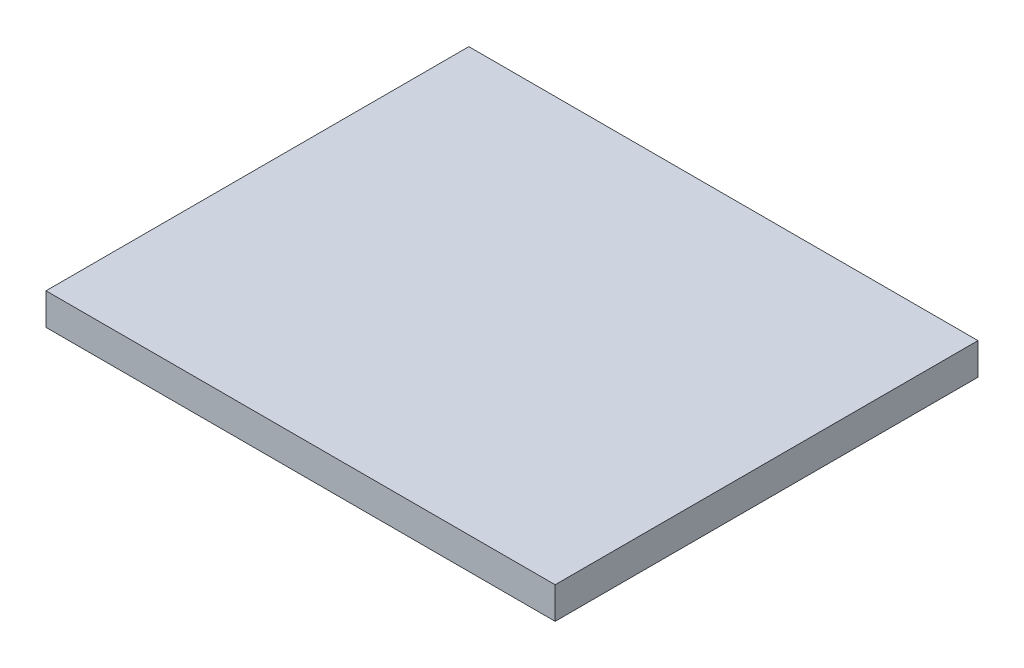
ISO-10303-21;
HEADER;
FILE_DESCRIPTION(('STEP AP214'),'2;1');
FILE_NAME('part.step','',(''),(''),'','','');
FILE_SCHEMA(('AUTOMOTIVE_DESIGN { 1 0 10303 214 1 1 1 1 }'));
ENDSEC;
DATA;
#1=APPLICATION_CONTEXT('core data for automotive mechanical design processes');
#2=APPLICATION_PROTOCOL_DEFINITION('international standard','automotive_design',2000,#1);
#3=PRODUCT_CONTEXT('',#1,'mechanical');
#4=PRODUCT('Part','Part','',(#3));
#5=PRODUCT_RELATED_PRODUCT_CATEGORY('part','',(#4));
#6=PRODUCT_DEFINITION_FORMATION('','',#4);
#7=PRODUCT_DEFINITION_CONTEXT('part definition',#1,'design');
#8=PRODUCT_DEFINITION('design','',#6,#7);
#9=PRODUCT_DEFINITION_SHAPE('','',#8);
#10=(LENGTH_UNIT() NAMED_UNIT(*) SI_UNIT(.MILLI.,.METRE.));
#11=(NAMED_UNIT(*) PLANE_ANGLE_UNIT() SI_UNIT($,.RADIAN.));
#12=(NAMED_UNIT(*) SI_UNIT($,.STERADIAN.) SOLID_ANGLE_UNIT());
#13=UNCERTAINTY_MEASURE_WITH_UNIT(LENGTH_MEASURE(1.E-05),#10,'distance_accuracy_value','');
#14=(GEOMETRIC_REPRESENTATION_CONTEXT(3) GLOBAL_UNCERTAINTY_ASSIGNED_CONTEXT((#13)) GLOBAL_UNIT_ASSIGNED_CONTEXT((#10,
#11,#12)) REPRESENTATION_CONTEXT('',''));
#15=CARTESIAN_POINT('',(0.,0.,0.));
#16=DIRECTION('',(0.,0.,1.));
#17=DIRECTION('',(1.,0.,0.));
#18=AXIS2_PLACEMENT_3D('',#15,#16,#17);
#19=CARTESIAN_POINT('',(0.,1.,0.));
#20=DIRECTION('',(1.,0.,0.));
#21=DIRECTION('',(0.,0.,-1.));
#22=AXIS2_PLACEMENT_3D('',#19,#20,#21);
#23=PLANE('',#22);
#24=DIRECTION('',(0.,0.,1.));
#25=VECTOR('',#24,1.);
#26=CARTESIAN_POINT('',(0.,0.,0.));
#27=LINE('',#26,#25);
#28=CARTESIAN_POINT('',(0.,0.,-13.33));
#29=VERTEX_POINT('',#28);
#30=CARTESIAN_POINT('',(0.,0.,0.));
#31=VERTEX_POINT('',#30);
#32=EDGE_CURVE('E101',#29,#31,#27,.T.);
#33=ORIENTED_EDGE('',*,*,#32,.T.);
#34=DIRECTION('',(0.,-1.,0.));
#35=VECTOR('',#34,1.);
#36=CARTESIAN_POINT('',(0.,1.,0.));
#37=LINE('',#36,#35);
#38=CARTESIAN_POINT('',(0.,1.,0.));
#39=VERTEX_POINT('',#38);
#40=EDGE_CURVE('E11',#39,#31,#37,.T.);
#41=ORIENTED_EDGE('',*,*,#40,.F.);
#42=DIRECTION('',(0.,0.,1.));
#43=VECTOR('',#42,1.);
#44=CARTESIAN_POINT('',(0.,1.,0.));
#45=LINE('',#44,#43);
#46=CARTESIAN_POINT('',(0.,1.,-13.33));
#47=VERTEX_POINT('',#46);
#48=EDGE_CURVE('E89',#47,#39,#45,.T.);
#49=ORIENTED_EDGE('',*,*,#48,.F.);
#50=DIRECTION('',(0.,-1.,0.));
#51=VECTOR('',#50,1.);
#52=CARTESIAN_POINT('',(0.,1.,-13.33));
#53=LINE('',#52,#51);
#54=EDGE_CURVE('E97',#47,#29,#53,.T.);
#55=ORIENTED_EDGE('',*,*,#54,.T.);
#56=EDGE_LOOP('',(#33,#41,#49,#55));
#57=FACE_BOUND('',#56,.T.);
#58=ADVANCED_FACE('F38',(#57),#23,.F.);
#59=CARTESIAN_POINT('',(0.,1.,0.));
#60=DIRECTION('',(0.,0.,-1.));
#61=DIRECTION('',(-1.,0.,0.));
#62=AXIS2_PLACEMENT_3D('',#59,#60,#61);
#63=PLANE('',#62);
#64=DIRECTION('',(1.,0.,0.));
#65=VECTOR('',#64,1.);
#66=CARTESIAN_POINT('',(0.,0.,0.));
#67=LINE('',#66,#65);
#68=CARTESIAN_POINT('',(16.05,0.,0.));
#69=VERTEX_POINT('',#68);
#70=EDGE_CURVE('E93',#31,#69,#67,.T.);
#71=ORIENTED_EDGE('',*,*,#70,.T.);
#72=DIRECTION('',(0.,-1.,0.));
#73=VECTOR('',#72,1.);
#74=CARTESIAN_POINT('',(16.05,1.,0.));
#75=LINE('',#74,#73);
#76=CARTESIAN_POINT('',(16.05,1.,0.));
#77=VERTEX_POINT('',#76);
#78=EDGE_CURVE('E46',#77,#69,#75,.T.);
#79=ORIENTED_EDGE('',*,*,#78,.F.);
#80=DIRECTION('',(1.,0.,0.));
#81=VECTOR('',#80,1.);
#82=CARTESIAN_POINT('',(0.,1.,0.));
#83=LINE('',#82,#81);
#84=EDGE_CURVE('E84',#39,#77,#83,.T.);
#85=ORIENTED_EDGE('',*,*,#84,.F.);
#86=ORIENTED_EDGE('',*,*,#40,.T.);
#87=EDGE_LOOP('',(#71,#79,#85,#86));
#88=FACE_BOUND('',#87,.T.);
#89=ADVANCED_FACE('F92',(#88),#63,.F.);
#90=CARTESIAN_POINT('',(16.05,1.,0.));
#91=DIRECTION('',(-1.,0.,0.));
#92=DIRECTION('',(0.,0.,1.));
#93=AXIS2_PLACEMENT_3D('',#90,#91,#92);
#94=PLANE('',#93);
#95=DIRECTION('',(0.,0.,-1.));
#96=VECTOR('',#95,1.);
#97=CARTESIAN_POINT('',(16.05,0.,0.));
#98=LINE('',#97,#96);
#99=CARTESIAN_POINT('',(16.05,0.,-13.33));
#100=VERTEX_POINT('',#99);
#101=EDGE_CURVE('E71',#69,#100,#98,.T.);
#102=ORIENTED_EDGE('',*,*,#101,.T.);
#103=DIRECTION('',(0.,-1.,0.));
#104=VECTOR('',#103,1.);
#105=CARTESIAN_POINT('',(16.05,1.,-13.33));
#106=LINE('',#105,#104);
#107=CARTESIAN_POINT('',(16.05,1.,-13.33));
#108=VERTEX_POINT('',#107);
#109=EDGE_CURVE('E94',#108,#100,#106,.T.);
#110=ORIENTED_EDGE('',*,*,#109,.F.);
#111=DIRECTION('',(0.,0.,-1.));
#112=VECTOR('',#111,1.);
#113=CARTESIAN_POINT('',(16.05,1.,0.));
#114=LINE('',#113,#112);
#115=EDGE_CURVE('E87',#77,#108,#114,.T.);
#116=ORIENTED_EDGE('',*,*,#115,.F.);
#117=ORIENTED_EDGE('',*,*,#78,.T.);
#118=EDGE_LOOP('',(#102,#110,#116,#117));
#119=FACE_BOUND('',#118,.T.);
#120=ADVANCED_FACE('F95',(#119),#94,.F.);
#121=CARTESIAN_POINT('',(0.,1.,-13.33));
#122=DIRECTION('',(0.,0.,1.));
#123=DIRECTION('',(1.,0.,0.));
#124=AXIS2_PLACEMENT_3D('',#121,#122,#123);
#125=PLANE('',#124);
#126=DIRECTION('',(-1.,0.,0.));
#127=VECTOR('',#126,1.);
#128=CARTESIAN_POINT('',(0.,0.,-13.33));
#129=LINE('',#128,#127);
#130=EDGE_CURVE('E77',#100,#29,#129,.T.);
#131=ORIENTED_EDGE('',*,*,#130,.T.);
#132=ORIENTED_EDGE('',*,*,#54,.F.);
#133=DIRECTION('',(-1.,0.,0.));
#134=VECTOR('',#133,1.);
#135=CARTESIAN_POINT('',(0.,1.,-13.33));
#136=LINE('',#135,#134);
#137=EDGE_CURVE('E54',#108,#47,#136,.T.);
#138=ORIENTED_EDGE('',*,*,#137,.F.);
#139=ORIENTED_EDGE('',*,*,#109,.T.);
#140=EDGE_LOOP('',(#131,#132,#138,#139));
#141=FACE_BOUND('',#140,.T.);
#142=ADVANCED_FACE('F108',(#141),#125,.F.);
#143=CARTESIAN_POINT('',(0.,1.,0.));
#144=DIRECTION('',(0.,-1.,0.));
#145=DIRECTION('',(0.,0.,-1.));
#146=AXIS2_PLACEMENT_3D('',#143,#144,#145);
#147=PLANE('',#146);
#148=ORIENTED_EDGE('',*,*,#48,.T.);
#149=ORIENTED_EDGE('',*,*,#84,.T.);
#150=ORIENTED_EDGE('',*,*,#115,.T.);
#151=ORIENTED_EDGE('',*,*,#137,.T.);
#152=EDGE_LOOP('',(#148,#149,#150,#151));
#153=FACE_BOUND('',#152,.T.);
#154=ADVANCED_FACE('F85',(#153),#147,.F.);
#155=CARTESIAN_POINT('',(0.,0.,0.));
#156=DIRECTION('',(0.,-1.,0.));
#157=DIRECTION('',(0.,0.,-1.));
#158=AXIS2_PLACEMENT_3D('',#155,#156,#157);
#159=PLANE('',#158);
#160=ORIENTED_EDGE('',*,*,#32,.F.);
#161=ORIENTED_EDGE('',*,*,#130,.F.);
#162=ORIENTED_EDGE('',*,*,#101,.F.);
#163=ORIENTED_EDGE('',*,*,#70,.F.);
#164=EDGE_LOOP('',(#160,#161,#162,#163));
#165=FACE_BOUND('',#164,.T.);
#166=ADVANCED_FACE('F111',(#165),#159,.T.);
#167=CLOSED_SHELL('',(#58,#89,#120,#142,#154,#166));
#168=MANIFOLD_SOLID_BREP('B2',#167);
#169=ADVANCED_BREP_SHAPE_REPRESENTATION('',(#18,#168),#14);
#170=SHAPE_DEFINITION_REPRESENTATION(#9,#169);
ENDSEC;
END-ISO-10303-21;
